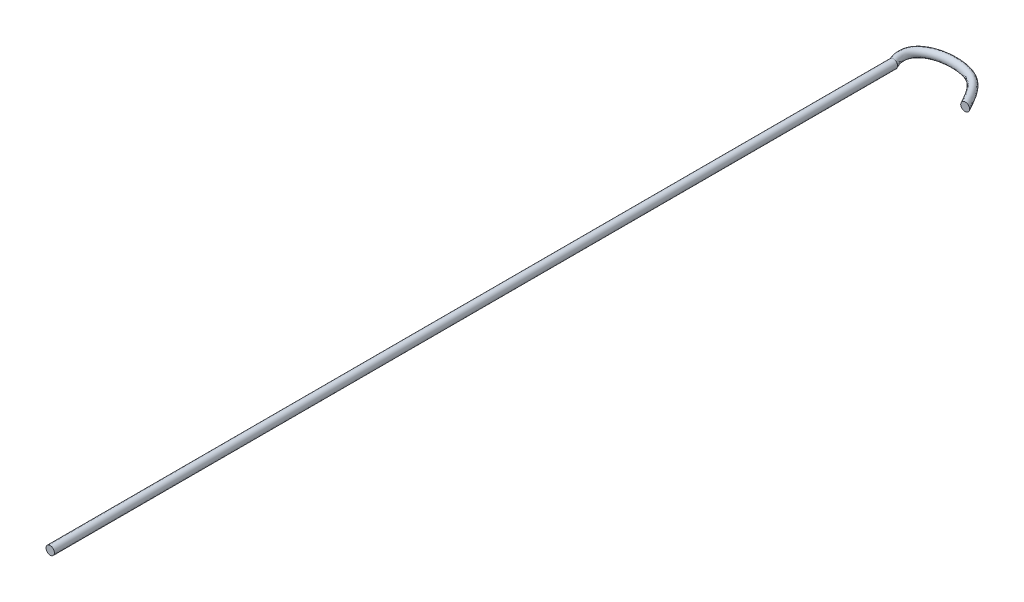
ISO-10303-21;
HEADER;
FILE_DESCRIPTION(('STEP AP214'),'2;1');
FILE_NAME('part.step','',(''),(''),'','','');
FILE_SCHEMA(('AUTOMOTIVE_DESIGN { 1 0 10303 214 1 1 1 1 }'));
ENDSEC;
DATA;
#1=APPLICATION_CONTEXT('core data for automotive mechanical design processes');
#2=APPLICATION_PROTOCOL_DEFINITION('international standard','automotive_design',2000,#1);
#3=PRODUCT_CONTEXT('',#1,'mechanical');
#4=PRODUCT('Part','Part','',(#3));
#5=PRODUCT_RELATED_PRODUCT_CATEGORY('part','',(#4));
#6=PRODUCT_DEFINITION_FORMATION('','',#4);
#7=PRODUCT_DEFINITION_CONTEXT('part definition',#1,'design');
#8=PRODUCT_DEFINITION('design','',#6,#7);
#9=PRODUCT_DEFINITION_SHAPE('','',#8);
#10=(LENGTH_UNIT() NAMED_UNIT(*) SI_UNIT(.MILLI.,.METRE.));
#11=(NAMED_UNIT(*) PLANE_ANGLE_UNIT() SI_UNIT($,.RADIAN.));
#12=(NAMED_UNIT(*) SI_UNIT($,.STERADIAN.) SOLID_ANGLE_UNIT());
#13=UNCERTAINTY_MEASURE_WITH_UNIT(LENGTH_MEASURE(1.E-05),#10,'distance_accuracy_value','');
#14=(GEOMETRIC_REPRESENTATION_CONTEXT(3) GLOBAL_UNCERTAINTY_ASSIGNED_CONTEXT((#13)) GLOBAL_UNIT_ASSIGNED_CONTEXT((#10,
#11,#12)) REPRESENTATION_CONTEXT('',''));
#15=CARTESIAN_POINT('',(0.,0.,0.));
#16=DIRECTION('',(0.,0.,1.));
#17=DIRECTION('',(1.,0.,0.));
#18=AXIS2_PLACEMENT_3D('',#15,#16,#17);
#19=CARTESIAN_POINT('',(0.,0.,200.));
#20=DIRECTION('',(0.,0.,-1.));
#21=DIRECTION('',(-1.,0.,0.));
#22=AXIS2_PLACEMENT_3D('',#19,#20,#21);
#23=CYLINDRICAL_SURFACE('',#22,1.);
#24=CARTESIAN_POINT('',(0.,0.,200.));
#25=DIRECTION('',(0.,0.,1.));
#26=DIRECTION('',(1.,0.,0.));
#27=AXIS2_PLACEMENT_3D('',#24,#25,#26);
#28=CIRCLE('',#27,1.);
#29=CARTESIAN_POINT('',(1.,0.,200.));
#30=VERTEX_POINT('',#29);
#31=EDGE_CURVE('E12',#30,#30,#28,.T.);
#32=ORIENTED_EDGE('',*,*,#31,.F.);
#33=EDGE_LOOP('',(#32));
#34=FACE_BOUND('',#33,.T.);
#35=CARTESIAN_POINT('',(0.,0.,0.));
#36=DIRECTION('',(0.,0.,1.));
#37=DIRECTION('',(1.,0.,0.));
#38=AXIS2_PLACEMENT_3D('',#35,#36,#37);
#39=CIRCLE('',#38,1.);
#40=CARTESIAN_POINT('',(1.,0.,0.));
#41=VERTEX_POINT('',#40);
#42=EDGE_CURVE('E43',#41,#41,#39,.T.);
#43=ORIENTED_EDGE('',*,*,#42,.T.);
#44=EDGE_LOOP('',(#43));
#45=FACE_BOUND('',#44,.T.);
#46=ADVANCED_FACE('F40',(#34,#45),#23,.T.);
#47=CARTESIAN_POINT('',(0.,0.,200.));
#48=DIRECTION('',(0.,0.,1.));
#49=DIRECTION('',(1.,0.,0.));
#50=AXIS2_PLACEMENT_3D('',#47,#48,#49);
#51=PLANE('',#50);
#52=ORIENTED_EDGE('',*,*,#31,.T.);
#53=EDGE_LOOP('',(#52));
#54=FACE_BOUND('',#53,.T.);
#55=ADVANCED_FACE('F61',(#54),#51,.T.);
#56=CARTESIAN_POINT('',(17.3959956778731,0.,0.365285775387754));
#57=DIRECTION('',(-0.0586415485905655,0.,-0.998279103647322));
#58=DIRECTION('',(-0.998279103647322,0.,0.0586415485905655));
#59=AXIS2_PLACEMENT_3D('',#56,#57,#58);
#60=PLANE('',#59);
#61=CARTESIAN_POINT('',(17.3959956778731,0.,0.365285775387754));
#62=DIRECTION('',(-0.0586415485905655,0.,-0.998279103647322));
#63=DIRECTION('',(-0.998279103647322,0.,0.0586415485905655));
#64=AXIS2_PLACEMENT_3D('',#61,#62,#63);
#65=CIRCLE('',#64,1.);
#66=CARTESIAN_POINT('',(16.3977165742258,0.,0.42392732397832));
#67=VERTEX_POINT('',#66);
#68=EDGE_CURVE('E47',#67,#67,#65,.T.);
#69=ORIENTED_EDGE('',*,*,#68,.F.);
#70=EDGE_LOOP('',(#69));
#71=FACE_BOUND('',#70,.T.);
#72=ADVANCED_FACE('F59',(#71),#60,.F.);
#73=CARTESIAN_POINT('',(1.,0.,0.));
#74=CARTESIAN_POINT('',(0.606117834048325,0.,-0.729690886222073));
#75=CARTESIAN_POINT('',(0.390321056370844,0.,-1.35820798763877));
#76=CARTESIAN_POINT('',(0.19970809502026,0.,-2.45116323929719));
#77=CARTESIAN_POINT('',(0.220101810324901,0.,-2.92084547895928));
#78=CARTESIAN_POINT('',(0.603229209065647,0.,-4.24293135250174));
#79=CARTESIAN_POINT('',(1.35915913264517,0.,-5.02134987547677));
#80=CARTESIAN_POINT('',(3.57631288101968,0.,-6.11557245787008));
#81=CARTESIAN_POINT('',(4.99696769676311,0.,-6.42511708271847));
#82=CARTESIAN_POINT('',(7.83669387018536,0.,-6.5560640715342));
#83=CARTESIAN_POINT('',(9.25637924902626,0.,-6.37688373753683));
#84=CARTESIAN_POINT('',(11.7332011218626,0.,-5.59402764355252));
#85=CARTESIAN_POINT('',(12.7397166948834,0.,-4.89359660120138));
#86=CARTESIAN_POINT('',(14.6104581496261,0.,-2.74875295822335));
#87=CARTESIAN_POINT('',(15.447259301054,0.,-1.31064218553129));
#88=CARTESIAN_POINT('',(16.3977165742258,0.,0.42392732397832));
#89=CARTESIAN_POINT('',(1.,2.,0.));
#90=CARTESIAN_POINT('',(0.606117834048325,2.,-0.729690886222073));
#91=CARTESIAN_POINT('',(0.390321056370844,2.,-1.35820798763877));
#92=CARTESIAN_POINT('',(0.19970809502026,2.,-2.45116323929719));
#93=CARTESIAN_POINT('',(0.220101810324901,2.,-2.92084547895928));
#94=CARTESIAN_POINT('',(0.603229209065647,2.,-4.24293135250174));
#95=CARTESIAN_POINT('',(1.35915913264517,2.,-5.02134987547677));
#96=CARTESIAN_POINT('',(3.57631288101968,2.,-6.11557245787008));
#97=CARTESIAN_POINT('',(4.99696769676311,2.,-6.42511708271847));
#98=CARTESIAN_POINT('',(7.83669387018536,2.,-6.5560640715342));
#99=CARTESIAN_POINT('',(9.25637924902626,2.,-6.37688373753683));
#100=CARTESIAN_POINT('',(11.7332011218626,2.,-5.59402764355252));
#101=CARTESIAN_POINT('',(12.7397166948834,2.,-4.89359660120138));
#102=CARTESIAN_POINT('',(14.6104581496261,2.,-2.74875295822335));
#103=CARTESIAN_POINT('',(15.447259301054,2.,-1.31064218553129));
#104=CARTESIAN_POINT('',(16.3977165742258,2.,0.42392732397832));
#105=CARTESIAN_POINT('',(-1.,2.,0.));
#106=CARTESIAN_POINT('',(-1.39388216978378,2.,-0.938055395928916));
#107=CARTESIAN_POINT('',(-1.5771590081526,2.,-1.82926666960738));
#108=CARTESIAN_POINT('',(-1.53818245299525,2.,-3.48683234420075));
#109=CARTESIAN_POINT('',(-1.31113893698833,2.,-4.24794265453043));
#110=CARTESIAN_POINT('',(-0.178494370540918,2.,-6.19548068288125));
#111=CARTESIAN_POINT('',(1.1073708221761,2.,-7.03313975769739));
#112=CARTESIAN_POINT('',(3.98940317464707,2.,-8.10052896117721));
#113=CARTESIAN_POINT('',(5.62613940572767,2.,-8.33651852103794));
#114=CARTESIAN_POINT('',(8.86982627167727,2.,-8.28289641409791));
#115=CARTESIAN_POINT('',(10.4761629313744,2.,-7.99386744207292));
#116=CARTESIAN_POINT('',(13.4383177013316,2.,-6.70624648539202));
#117=CARTESIAN_POINT('',(14.6241385448168,2.,-5.60862704387016));
#118=CARTESIAN_POINT('',(16.6128212625358,2.,-2.97865777927167));
#119=CARTESIAN_POINT('',(17.4431078479799,2.,-1.44000612353684));
#120=CARTESIAN_POINT('',(18.3942747815204,2.,0.306644226797189));
#121=CARTESIAN_POINT('',(-1.,0.,0.));
#122=CARTESIAN_POINT('',(-1.39388216978378,0.,-0.938055395928916));
#123=CARTESIAN_POINT('',(-1.5771590081526,0.,-1.82926666960738));
#124=CARTESIAN_POINT('',(-1.53818245299525,0.,-3.48683234420075));
#125=CARTESIAN_POINT('',(-1.31113893698833,0.,-4.24794265453043));
#126=CARTESIAN_POINT('',(-0.178494370540918,0.,-6.19548068288125));
#127=CARTESIAN_POINT('',(1.1073708221761,0.,-7.03313975769739));
#128=CARTESIAN_POINT('',(3.98940317464707,0.,-8.10052896117721));
#129=CARTESIAN_POINT('',(5.62613940572734,0.,-8.33651852103794));
#130=CARTESIAN_POINT('',(8.86982627167759,0.,-8.28289641409791));
#131=CARTESIAN_POINT('',(10.4761629313744,0.,-7.99386744207321));
#132=CARTESIAN_POINT('',(13.4383177013316,0.,-6.70624648539168));
#133=CARTESIAN_POINT('',(14.6241385448175,0.,-5.60862704387016));
#134=CARTESIAN_POINT('',(16.6128212625351,0.,-2.97865777927167));
#135=CARTESIAN_POINT('',(17.4431078479799,0.,-1.44000612353686));
#136=CARTESIAN_POINT('',(18.3942747815204,0.,0.306644226797189));
#137=CARTESIAN_POINT('',(-1.,-2.,0.));
#138=CARTESIAN_POINT('',(-1.39388216978378,-2.,-0.938055395928916));
#139=CARTESIAN_POINT('',(-1.5771590081526,-2.,-1.82926666960738));
#140=CARTESIAN_POINT('',(-1.53818245299525,-2.,-3.48683234420075));
#141=CARTESIAN_POINT('',(-1.31113893698833,-2.,-4.24794265453043));
#142=CARTESIAN_POINT('',(-0.178494370540919,-2.,-6.19548068288125));
#143=CARTESIAN_POINT('',(1.1073708221761,-2.,-7.03313975769739));
#144=CARTESIAN_POINT('',(3.98940317464707,-2.,-8.10052896117721));
#145=CARTESIAN_POINT('',(5.62613940572701,-2.,-8.33651852103794));
#146=CARTESIAN_POINT('',(8.86982627167792,-2.,-8.28289641409791));
#147=CARTESIAN_POINT('',(10.4761629313744,-2.,-7.99386744207349));
#148=CARTESIAN_POINT('',(13.4383177013316,-2.,-6.70624648539134));
#149=CARTESIAN_POINT('',(14.6241385448181,-2.,-5.60862704387016));
#150=CARTESIAN_POINT('',(16.6128212625345,-2.,-2.97865777927167));
#151=CARTESIAN_POINT('',(17.4431078479799,-2.,-1.44000612353689));
#152=CARTESIAN_POINT('',(18.3942747815204,-2.,0.306644226797189));
#153=CARTESIAN_POINT('',(1.,-2.,0.));
#154=CARTESIAN_POINT('',(0.606117834048325,-2.,-0.729690886222073));
#155=CARTESIAN_POINT('',(0.390321056370844,-2.,-1.35820798763877));
#156=CARTESIAN_POINT('',(0.19970809502026,-2.,-2.45116323929719));
#157=CARTESIAN_POINT('',(0.220101810324901,-2.,-2.92084547895928));
#158=CARTESIAN_POINT('',(0.603229209065647,-2.,-4.24293135250174));
#159=CARTESIAN_POINT('',(1.35915913264517,-2.,-5.02134987547677));
#160=CARTESIAN_POINT('',(3.57631288101968,-2.,-6.11557245787008));
#161=CARTESIAN_POINT('',(4.99696769676311,-2.,-6.42511708271847));
#162=CARTESIAN_POINT('',(7.83669387018536,-2.,-6.5560640715342));
#163=CARTESIAN_POINT('',(9.25637924902626,-2.,-6.37688373753683));
#164=CARTESIAN_POINT('',(11.7332011218626,-2.,-5.59402764355252));
#165=CARTESIAN_POINT('',(12.7397166948834,-2.,-4.89359660120138));
#166=CARTESIAN_POINT('',(14.6104581496261,-2.,-2.74875295822335));
#167=CARTESIAN_POINT('',(15.447259301054,-2.,-1.31064218553129));
#168=CARTESIAN_POINT('',(16.3977165742258,-2.,0.42392732397832));
#169=CARTESIAN_POINT('',(1.,0.,0.));
#170=CARTESIAN_POINT('',(0.606117834048325,0.,-0.729690886222073));
#171=CARTESIAN_POINT('',(0.390321056370844,0.,-1.35820798763877));
#172=CARTESIAN_POINT('',(0.19970809502026,0.,-2.45116323929719));
#173=CARTESIAN_POINT('',(0.220101810324901,0.,-2.92084547895928));
#174=CARTESIAN_POINT('',(0.603229209065647,0.,-4.24293135250174));
#175=CARTESIAN_POINT('',(1.35915913264517,0.,-5.02134987547677));
#176=CARTESIAN_POINT('',(3.57631288101968,0.,-6.11557245787008));
#177=CARTESIAN_POINT('',(4.99696769676311,0.,-6.42511708271847));
#178=CARTESIAN_POINT('',(7.83669387018536,0.,-6.5560640715342));
#179=CARTESIAN_POINT('',(9.25637924902626,0.,-6.37688373753683));
#180=CARTESIAN_POINT('',(11.7332011218626,0.,-5.59402764355252));
#181=CARTESIAN_POINT('',(12.7397166948834,0.,-4.89359660120138));
#182=CARTESIAN_POINT('',(14.6104581496261,0.,-2.74875295822335));
#183=CARTESIAN_POINT('',(15.447259301054,0.,-1.31064218553129));
#184=CARTESIAN_POINT('',(16.3977165742258,0.,0.42392732397832));
#185=(BOUNDED_SURFACE() B_SPLINE_SURFACE(3,3,((#73,#74,#75,#76,#77,#78,#79,#80,#81,#82,#83,#84,
#85,#86,#87,#88),(#89,#90,#91,#92,#93,#94,#95,#96,#97,#98,#99,#100,#101,#102,#103,#104),(#105,
#106,#107,#108,#109,#110,#111,#112,#113,#114,#115,#116,#117,#118,#119,#120),(#121,#122,#123,
#124,#125,#126,#127,#128,#129,#130,#131,#132,#133,#134,#135,#136),(#137,#138,#139,#140,#141,
#142,#143,#144,#145,#146,#147,#148,#149,#150,#151,#152),(#153,#154,#155,#156,#157,#158,#159,
#160,#161,#162,#163,#164,#165,#166,#167,#168),(#169,#170,#171,#172,#173,#174,#175,#176,#177,
#178,#179,#180,#181,#182,#183,#184)),.UNSPECIFIED.,.T.,.F.,.F.) B_SPLINE_SURFACE_WITH_KNOTS((4,
3,4),(4,2,2,2,2,2,2,4),(0.,0.5,1.),(0.,0.07844145419898,0.15688290839796,0.31376581679592,
0.47064872519388,0.62753163359184,0.81376581679592,1.),
.UNSPECIFIED.) GEOMETRIC_REPRESENTATION_ITEM() RATIONAL_B_SPLINE_SURFACE(((1.,1.,1.,1.,1.,1.,1.,
1.,1.,1.,1.,1.,1.,1.,1.,1.),(0.333333333333333,0.333333333333333,0.333333333333333,
0.333333333333333,0.333333333333333,0.333333333333333,0.333333333333333,0.333333333333333,
0.333333333333333,0.333333333333333,0.333333333333333,0.333333333333333,0.333333333333333,
0.333333333333333,0.333333333333333,0.333333333333333),(0.333333333333333,0.333333333333333,
0.333333333333333,0.333333333333333,0.333333333333333,0.333333333333333,0.333333333333333,
0.333333333333333,0.333333333333333,0.333333333333333,0.333333333333333,0.333333333333333,
0.333333333333333,0.333333333333333,0.333333333333333,0.333333333333333),(1.,1.,1.,1.,1.,1.,1.,
1.,1.,1.,1.,1.,1.,1.,1.,1.),(0.333333333333333,0.333333333333333,0.333333333333333,
0.333333333333333,0.333333333333333,0.333333333333333,0.333333333333333,0.333333333333333,
0.333333333333333,0.333333333333333,0.333333333333333,0.333333333333333,0.333333333333333,
0.333333333333333,0.333333333333333,0.333333333333333),(0.333333333333333,0.333333333333333,
0.333333333333333,0.333333333333333,0.333333333333333,0.333333333333333,0.333333333333333,
0.333333333333333,0.333333333333333,0.333333333333333,0.333333333333333,0.333333333333333,
0.333333333333333,0.333333333333333,0.333333333333333,0.333333333333333),(1.,1.,1.,1.,1.,1.,1.,
1.,1.,1.,1.,1.,1.,1.,1.,1.))) REPRESENTATION_ITEM('') SURFACE());
#186=ORIENTED_EDGE('',*,*,#68,.T.);
#187=EDGE_LOOP('',(#186));
#188=FACE_BOUND('',#187,.T.);
#189=ORIENTED_EDGE('',*,*,#42,.F.);
#190=EDGE_LOOP('',(#189));
#191=FACE_BOUND('',#190,.T.);
#192=ADVANCED_FACE('F51',(#188,#191),#185,.F.);
#193=CLOSED_SHELL('',(#46,#55,#72,#192));
#194=MANIFOLD_SOLID_BREP('B2',#193);
#195=ADVANCED_BREP_SHAPE_REPRESENTATION('',(#18,#194),#14);
#196=SHAPE_DEFINITION_REPRESENTATION(#9,#195);
ENDSEC;
END-ISO-10303-21;
